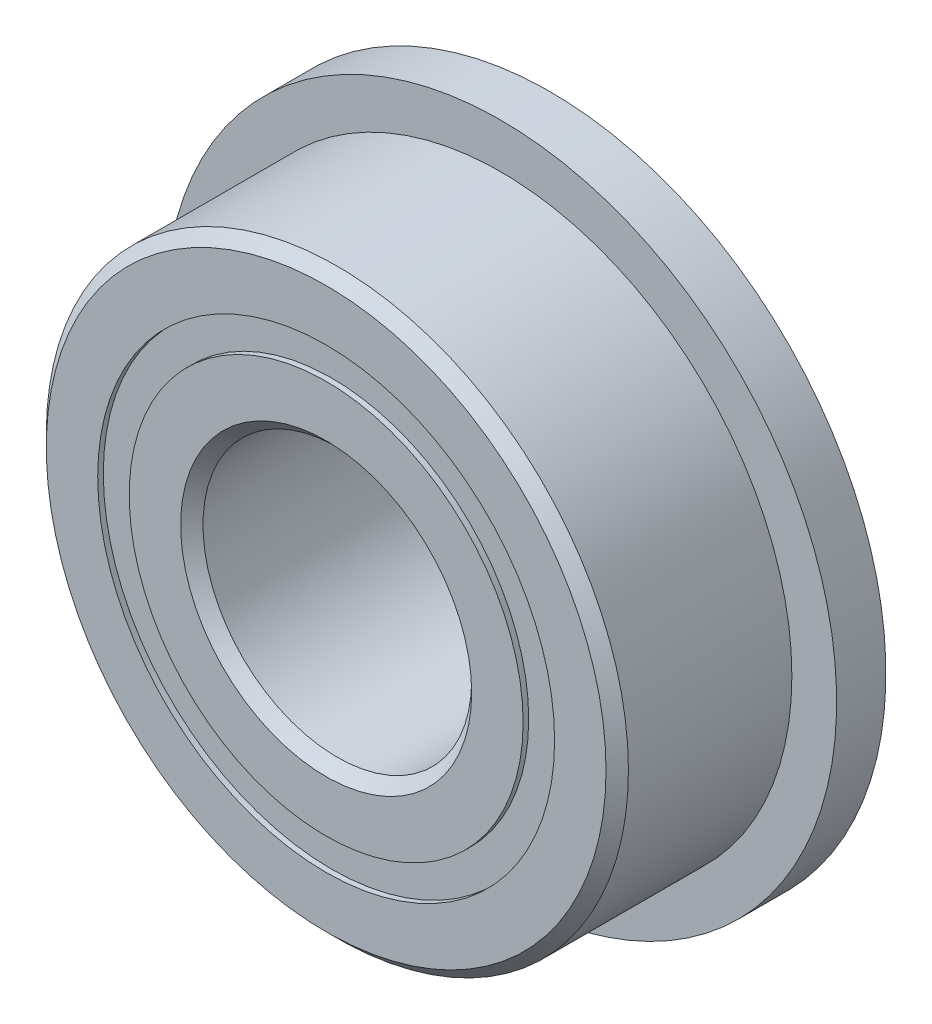
ISO-10303-21;
HEADER;
FILE_DESCRIPTION(('STEP AP214'),'2;1');
FILE_NAME('part.step','',(''),(''),'','','');
FILE_SCHEMA(('AUTOMOTIVE_DESIGN { 1 0 10303 214 1 1 1 1 }'));
ENDSEC;
DATA;
#1=APPLICATION_CONTEXT('core data for automotive mechanical design processes');
#2=APPLICATION_PROTOCOL_DEFINITION('international standard','automotive_design',2000,#1);
#3=PRODUCT_CONTEXT('',#1,'mechanical');
#4=PRODUCT('Part','Part','',(#3));
#5=PRODUCT_RELATED_PRODUCT_CATEGORY('part','',(#4));
#6=PRODUCT_DEFINITION_FORMATION('','',#4);
#7=PRODUCT_DEFINITION_CONTEXT('part definition',#1,'design');
#8=PRODUCT_DEFINITION('design','',#6,#7);
#9=PRODUCT_DEFINITION_SHAPE('','',#8);
#10=(LENGTH_UNIT() NAMED_UNIT(*) SI_UNIT(.MILLI.,.METRE.));
#11=(NAMED_UNIT(*) PLANE_ANGLE_UNIT() SI_UNIT($,.RADIAN.));
#12=(NAMED_UNIT(*) SI_UNIT($,.STERADIAN.) SOLID_ANGLE_UNIT());
#13=UNCERTAINTY_MEASURE_WITH_UNIT(LENGTH_MEASURE(1.E-05),#10,'distance_accuracy_value','');
#14=(GEOMETRIC_REPRESENTATION_CONTEXT(3) GLOBAL_UNCERTAINTY_ASSIGNED_CONTEXT((#13)) GLOBAL_UNIT_ASSIGNED_CONTEXT((#10,
#11,#12)) REPRESENTATION_CONTEXT('',''));
#15=CARTESIAN_POINT('',(0.,0.,0.));
#16=DIRECTION('',(0.,0.,1.));
#17=DIRECTION('',(1.,0.,0.));
#18=AXIS2_PLACEMENT_3D('',#15,#16,#17);
#19=CARTESIAN_POINT('',(0.,5.10164835164835,-2.375));
#20=DIRECTION('',(0.,0.,1.));
#21=DIRECTION('',(1.,0.,0.));
#22=AXIS2_PLACEMENT_3D('',#19,#20,#21);
#23=PLANE('',#22);
#24=CARTESIAN_POINT('',(0.,0.,-2.375));
#25=DIRECTION('',(0.,0.,1.));
#26=DIRECTION('',(1.,0.,0.));
#27=AXIS2_PLACEMENT_3D('',#24,#25,#26);
#28=CIRCLE('',#27,5.10164835164835);
#29=CARTESIAN_POINT('',(5.10164835164835,0.,-2.375));
#30=VERTEX_POINT('',#29);
#31=EDGE_CURVE('E65',#30,#30,#28,.T.);
#32=ORIENTED_EDGE('',*,*,#31,.F.);
#33=EDGE_LOOP('',(#32));
#34=FACE_BOUND('',#33,.T.);
#35=CARTESIAN_POINT('',(0.,0.,-2.375));
#36=DIRECTION('',(0.,0.,1.));
#37=DIRECTION('',(1.,0.,0.));
#38=AXIS2_PLACEMENT_3D('',#35,#36,#37);
#39=CIRCLE('',#38,4.39835164835165);
#40=CARTESIAN_POINT('',(4.39835164835165,0.,-2.375));
#41=VERTEX_POINT('',#40);
#42=EDGE_CURVE('E13',#41,#41,#39,.T.);
#43=ORIENTED_EDGE('',*,*,#42,.T.);
#44=EDGE_LOOP('',(#43));
#45=FACE_BOUND('',#44,.T.);
#46=ADVANCED_FACE('F51',(#34,#45),#23,.F.);
#47=CARTESIAN_POINT('',(0.,0.,2.5));
#48=DIRECTION('',(0.,0.,1.));
#49=DIRECTION('',(1.,0.,0.));
#50=AXIS2_PLACEMENT_3D('',#47,#48,#49);
#51=CYLINDRICAL_SURFACE('',#50,4.39835164835165);
#52=ORIENTED_EDGE('',*,*,#42,.F.);
#53=EDGE_LOOP('',(#52));
#54=FACE_BOUND('',#53,.T.);
#55=CARTESIAN_POINT('',(0.,0.,-1.16542887575844));
#56=DIRECTION('',(0.,0.,1.));
#57=DIRECTION('',(1.,0.,0.));
#58=AXIS2_PLACEMENT_3D('',#55,#56,#57);
#59=CIRCLE('',#58,4.39835164835165);
#60=CARTESIAN_POINT('',(4.39835164835165,0.,-1.16542887575844));
#61=VERTEX_POINT('',#60);
#62=EDGE_CURVE('E57',#61,#61,#59,.T.);
#63=ORIENTED_EDGE('',*,*,#62,.T.);
#64=EDGE_LOOP('',(#63));
#65=FACE_BOUND('',#64,.T.);
#66=ADVANCED_FACE('F74',(#54,#65),#51,.F.);
#67=CARTESIAN_POINT('',(0.,5.10164835164835,-1.16542887575844));
#68=DIRECTION('',(0.,0.,-1.));
#69=DIRECTION('',(-1.,0.,0.));
#70=AXIS2_PLACEMENT_3D('',#67,#68,#69);
#71=PLANE('',#70);
#72=ORIENTED_EDGE('',*,*,#62,.F.);
#73=EDGE_LOOP('',(#72));
#74=FACE_BOUND('',#73,.T.);
#75=CARTESIAN_POINT('',(0.,0.,-1.16542887575844));
#76=DIRECTION('',(0.,0.,1.));
#77=DIRECTION('',(1.,0.,0.));
#78=AXIS2_PLACEMENT_3D('',#75,#76,#77);
#79=CIRCLE('',#78,5.10164835164835);
#80=CARTESIAN_POINT('',(5.10164835164835,0.,-1.16542887575844));
#81=VERTEX_POINT('',#80);
#82=EDGE_CURVE('E61',#81,#81,#79,.T.);
#83=ORIENTED_EDGE('',*,*,#82,.T.);
#84=EDGE_LOOP('',(#83));
#85=FACE_BOUND('',#84,.T.);
#86=ADVANCED_FACE('F78',(#74,#85),#71,.F.);
#87=CARTESIAN_POINT('',(0.,0.,2.5));
#88=DIRECTION('',(0.,0.,1.));
#89=DIRECTION('',(1.,0.,0.));
#90=AXIS2_PLACEMENT_3D('',#87,#88,#89);
#91=CYLINDRICAL_SURFACE('',#90,5.10164835164835);
#92=ORIENTED_EDGE('',*,*,#82,.F.);
#93=EDGE_LOOP('',(#92));
#94=FACE_BOUND('',#93,.T.);
#95=ORIENTED_EDGE('',*,*,#31,.T.);
#96=EDGE_LOOP('',(#95));
#97=FACE_BOUND('',#96,.T.);
#98=ADVANCED_FACE('F71',(#94,#97),#91,.T.);
#99=CLOSED_SHELL('',(#46,#66,#86,#98));
#100=MANIFOLD_SOLID_BREP('B2',#99);
#101=CARTESIAN_POINT('',(0.,5.10164835164835,2.375));
#102=DIRECTION('',(0.,0.,-1.));
#103=DIRECTION('',(-1.,0.,0.));
#104=AXIS2_PLACEMENT_3D('',#101,#102,#103);
#105=PLANE('',#104);
#106=CARTESIAN_POINT('',(0.,0.,2.375));
#107=DIRECTION('',(0.,0.,1.));
#108=DIRECTION('',(1.,0.,0.));
#109=AXIS2_PLACEMENT_3D('',#106,#107,#108);
#110=CIRCLE('',#109,4.39835164835165);
#111=CARTESIAN_POINT('',(4.39835164835165,0.,2.375));
#112=VERTEX_POINT('',#111);
#113=EDGE_CURVE('E50',#112,#112,#110,.T.);
#114=ORIENTED_EDGE('',*,*,#113,.F.);
#115=EDGE_LOOP('',(#114));
#116=FACE_BOUND('',#115,.T.);
#117=CARTESIAN_POINT('',(0.,0.,2.375));
#118=DIRECTION('',(0.,0.,1.));
#119=DIRECTION('',(1.,0.,0.));
#120=AXIS2_PLACEMENT_3D('',#117,#118,#119);
#121=CIRCLE('',#120,5.10164835164835);
#122=CARTESIAN_POINT('',(5.10164835164835,0.,2.375));
#123=VERTEX_POINT('',#122);
#124=EDGE_CURVE('E138',#123,#123,#121,.T.);
#125=ORIENTED_EDGE('',*,*,#124,.T.);
#126=EDGE_LOOP('',(#125));
#127=FACE_BOUND('',#126,.T.);
#128=ADVANCED_FACE('F124',(#116,#127),#105,.F.);
#129=CARTESIAN_POINT('',(0.,0.,2.5));
#130=DIRECTION('',(0.,0.,1.));
#131=DIRECTION('',(1.,0.,0.));
#132=AXIS2_PLACEMENT_3D('',#129,#130,#131);
#133=CYLINDRICAL_SURFACE('',#132,4.39835164835165);
#134=CARTESIAN_POINT('',(0.,0.,1.16542887575843));
#135=DIRECTION('',(0.,0.,1.));
#136=DIRECTION('',(1.,0.,0.));
#137=AXIS2_PLACEMENT_3D('',#134,#135,#136);
#138=CIRCLE('',#137,4.39835164835165);
#139=CARTESIAN_POINT('',(4.39835164835165,0.,1.16542887575843));
#140=VERTEX_POINT('',#139);
#141=EDGE_CURVE('E130',#140,#140,#138,.T.);
#142=ORIENTED_EDGE('',*,*,#141,.F.);
#143=EDGE_LOOP('',(#142));
#144=FACE_BOUND('',#143,.T.);
#145=ORIENTED_EDGE('',*,*,#113,.T.);
#146=EDGE_LOOP('',(#145));
#147=FACE_BOUND('',#146,.T.);
#148=ADVANCED_FACE('F153',(#144,#147),#133,.F.);
#149=CARTESIAN_POINT('',(0.,5.10164835164835,1.16542887575843));
#150=DIRECTION('',(0.,0.,1.));
#151=DIRECTION('',(1.,0.,0.));
#152=AXIS2_PLACEMENT_3D('',#149,#150,#151);
#153=PLANE('',#152);
#154=CARTESIAN_POINT('',(0.,0.,1.16542887575843));
#155=DIRECTION('',(0.,0.,1.));
#156=DIRECTION('',(1.,0.,0.));
#157=AXIS2_PLACEMENT_3D('',#154,#155,#156);
#158=CIRCLE('',#157,5.10164835164835);
#159=CARTESIAN_POINT('',(5.10164835164835,0.,1.16542887575843));
#160=VERTEX_POINT('',#159);
#161=EDGE_CURVE('E134',#160,#160,#158,.T.);
#162=ORIENTED_EDGE('',*,*,#161,.F.);
#163=EDGE_LOOP('',(#162));
#164=FACE_BOUND('',#163,.T.);
#165=ORIENTED_EDGE('',*,*,#141,.T.);
#166=EDGE_LOOP('',(#165));
#167=FACE_BOUND('',#166,.T.);
#168=ADVANCED_FACE('F148',(#164,#167),#153,.F.);
#169=CARTESIAN_POINT('',(0.,0.,2.5));
#170=DIRECTION('',(0.,0.,1.));
#171=DIRECTION('',(1.,0.,0.));
#172=AXIS2_PLACEMENT_3D('',#169,#170,#171);
#173=CYLINDRICAL_SURFACE('',#172,5.10164835164835);
#174=ORIENTED_EDGE('',*,*,#124,.F.);
#175=EDGE_LOOP('',(#174));
#176=FACE_BOUND('',#175,.T.);
#177=ORIENTED_EDGE('',*,*,#161,.T.);
#178=EDGE_LOOP('',(#177));
#179=FACE_BOUND('',#178,.T.);
#180=ADVANCED_FACE('F145',(#176,#179),#173,.T.);
#181=CLOSED_SHELL('',(#128,#148,#168,#180));
#182=MANIFOLD_SOLID_BREP('B8',#181);
#183=CARTESIAN_POINT('',(-2.37499999999995,4.11362066797611,0.));
#184=DIRECTION('',(0.,0.,1.));
#185=DIRECTION('',(0.499999999999989,-0.866025403784445,0.));
#186=AXIS2_PLACEMENT_3D('',#183,#184,#185);
#187=SPHERICAL_SURFACE('',#186,1.16542887575844);
#188=CARTESIAN_POINT('',(-2.37499999999995,4.11362066797611,1.16542887575843));
#189=VERTEX_POINT('',#188);
#190=VERTEX_LOOP('',#189);
#191=FACE_BOUND('',#190,.T.);
#192=ADVANCED_FACE('F192',(#191),#187,.T.);
#193=CLOSED_SHELL('',(#192));
#194=MANIFOLD_SOLID_BREP('B45',#193);
#195=CARTESIAN_POINT('',(-4.11362066797606,2.37500000000005,0.));
#196=DIRECTION('',(0.,0.,1.));
#197=DIRECTION('',(0.866025403784433,-0.50000000000001,0.));
#198=AXIS2_PLACEMENT_3D('',#195,#196,#197);
#199=SPHERICAL_SURFACE('',#198,1.16542887575844);
#200=CARTESIAN_POINT('',(-4.11362066797606,2.37500000000005,1.16542887575843));
#201=VERTEX_POINT('',#200);
#202=VERTEX_LOOP('',#201);
#203=FACE_BOUND('',#202,.T.);
#204=ADVANCED_FACE('F215',(#203),#199,.T.);
#205=CLOSED_SHELL('',(#204));
#206=MANIFOLD_SOLID_BREP('B120',#205);
#207=CARTESIAN_POINT('',(-4.75,0.,0.));
#208=DIRECTION('',(0.,0.,1.));
#209=DIRECTION('',(1.,0.,0.));
#210=AXIS2_PLACEMENT_3D('',#207,#208,#209);
#211=SPHERICAL_SURFACE('',#210,1.16542887575844);
#212=CARTESIAN_POINT('',(-4.75,0.,1.16542887575843));
#213=VERTEX_POINT('',#212);
#214=VERTEX_LOOP('',#213);
#215=FACE_BOUND('',#214,.T.);
#216=ADVANCED_FACE('F238',(#215),#211,.T.);
#217=CLOSED_SHELL('',(#216));
#218=MANIFOLD_SOLID_BREP('B188',#217);
#219=CARTESIAN_POINT('',(-4.1136206679761,-2.37499999999996,0.));
#220=DIRECTION('',(0.,0.,1.));
#221=DIRECTION('',(0.866025403784443,0.499999999999992,0.));
#222=AXIS2_PLACEMENT_3D('',#219,#220,#221);
#223=SPHERICAL_SURFACE('',#222,1.16542887575844);
#224=CARTESIAN_POINT('',(-4.1136206679761,-2.37499999999996,1.16542887575843));
#225=VERTEX_POINT('',#224);
#226=VERTEX_LOOP('',#225);
#227=FACE_BOUND('',#226,.T.);
#228=ADVANCED_FACE('F261',(#227),#223,.T.);
#229=CLOSED_SHELL('',(#228));
#230=MANIFOLD_SOLID_BREP('B211',#229);
#231=CARTESIAN_POINT('',(-2.37500000000003,-4.11362066797606,0.));
#232=DIRECTION('',(0.,0.,1.));
#233=DIRECTION('',(0.500000000000007,0.866025403784435,0.));
#234=AXIS2_PLACEMENT_3D('',#231,#232,#233);
#235=SPHERICAL_SURFACE('',#234,1.16542887575844);
#236=CARTESIAN_POINT('',(-2.37500000000003,-4.11362066797606,1.16542887575843));
#237=VERTEX_POINT('',#236);
#238=VERTEX_LOOP('',#237);
#239=FACE_BOUND('',#238,.T.);
#240=ADVANCED_FACE('F283',(#239),#235,.T.);
#241=CLOSED_SHELL('',(#240));
#242=MANIFOLD_SOLID_BREP('B234',#241);
#243=CARTESIAN_POINT('',(0.,-4.75,0.));
#244=DIRECTION('',(0.,0.,1.));
#245=DIRECTION('',(0.,1.,0.));
#246=AXIS2_PLACEMENT_3D('',#243,#244,#245);
#247=SPHERICAL_SURFACE('',#246,1.16542887575844);
#248=CARTESIAN_POINT('',(0.,-4.75,1.16542887575843));
#249=VERTEX_POINT('',#248);
#250=VERTEX_LOOP('',#249);
#251=FACE_BOUND('',#250,.T.);
#252=ADVANCED_FACE('F305',(#251),#247,.T.);
#253=CLOSED_SHELL('',(#252));
#254=MANIFOLD_SOLID_BREP('B257',#253);
#255=CARTESIAN_POINT('',(2.37499999999998,-4.1136206679761,0.));
#256=DIRECTION('',(0.,0.,1.));
#257=DIRECTION('',(-0.499999999999995,0.866025403784442,0.));
#258=AXIS2_PLACEMENT_3D('',#255,#256,#257);
#259=SPHERICAL_SURFACE('',#258,1.16542887575844);
#260=CARTESIAN_POINT('',(2.37499999999998,-4.1136206679761,1.16542887575843));
#261=VERTEX_POINT('',#260);
#262=VERTEX_LOOP('',#261);
#263=FACE_BOUND('',#262,.T.);
#264=ADVANCED_FACE('F327',(#263),#259,.T.);
#265=CLOSED_SHELL('',(#264));
#266=MANIFOLD_SOLID_BREP('B279',#265);
#267=CARTESIAN_POINT('',(4.11362066797607,-2.37500000000002,0.));
#268=DIRECTION('',(0.,0.,1.));
#269=DIRECTION('',(-0.866025403784436,0.500000000000004,0.));
#270=AXIS2_PLACEMENT_3D('',#267,#268,#269);
#271=SPHERICAL_SURFACE('',#270,1.16542887575844);
#272=CARTESIAN_POINT('',(4.11362066797607,-2.37500000000002,1.16542887575843));
#273=VERTEX_POINT('',#272);
#274=VERTEX_LOOP('',#273);
#275=FACE_BOUND('',#274,.T.);
#276=ADVANCED_FACE('F350',(#275),#271,.T.);
#277=CLOSED_SHELL('',(#276));
#278=MANIFOLD_SOLID_BREP('B301',#277);
#279=CARTESIAN_POINT('',(4.75,0.,0.));
#280=DIRECTION('',(0.,0.,1.));
#281=DIRECTION('',(-1.,0.,0.));
#282=AXIS2_PLACEMENT_3D('',#279,#280,#281);
#283=SPHERICAL_SURFACE('',#282,1.16542887575844);
#284=CARTESIAN_POINT('',(4.75,0.,1.16542887575843));
#285=VERTEX_POINT('',#284);
#286=VERTEX_LOOP('',#285);
#287=FACE_BOUND('',#286,.T.);
#288=ADVANCED_FACE('F373',(#287),#283,.T.);
#289=CLOSED_SHELL('',(#288));
#290=MANIFOLD_SOLID_BREP('B323',#289);
#291=CARTESIAN_POINT('',(4.11362066797609,2.37499999999999,0.));
#292=DIRECTION('',(0.,0.,1.));
#293=DIRECTION('',(-0.86602540378444,-0.499999999999998,0.));
#294=AXIS2_PLACEMENT_3D('',#291,#292,#293);
#295=SPHERICAL_SURFACE('',#294,1.16542887575844);
#296=CARTESIAN_POINT('',(4.11362066797609,2.37499999999999,1.16542887575843));
#297=VERTEX_POINT('',#296);
#298=VERTEX_LOOP('',#297);
#299=FACE_BOUND('',#298,.T.);
#300=ADVANCED_FACE('F395',(#299),#295,.T.);
#301=CLOSED_SHELL('',(#300));
#302=MANIFOLD_SOLID_BREP('B346',#301);
#303=CARTESIAN_POINT('',(2.375,4.11362066797608,0.));
#304=DIRECTION('',(0.,0.,1.));
#305=DIRECTION('',(-0.500000000000001,-0.866025403784438,0.));
#306=AXIS2_PLACEMENT_3D('',#303,#304,#305);
#307=SPHERICAL_SURFACE('',#306,1.16542887575844);
#308=CARTESIAN_POINT('',(2.375,4.11362066797608,1.16542887575843));
#309=VERTEX_POINT('',#308);
#310=VERTEX_LOOP('',#309);
#311=FACE_BOUND('',#310,.T.);
#312=ADVANCED_FACE('F416',(#311),#307,.T.);
#313=CLOSED_SHELL('',(#312));
#314=MANIFOLD_SOLID_BREP('B369',#313);
#315=CARTESIAN_POINT('',(0.,4.75,0.));
#316=DIRECTION('',(0.,0.,1.));
#317=DIRECTION('',(0.,-1.,0.));
#318=AXIS2_PLACEMENT_3D('',#315,#316,#317);
#319=SPHERICAL_SURFACE('',#318,1.16542887575844);
#320=CARTESIAN_POINT('',(0.,4.75,1.16542887575843));
#321=VERTEX_POINT('',#320);
#322=VERTEX_LOOP('',#321);
#323=FACE_BOUND('',#322,.T.);
#324=ADVANCED_FACE('F438',(#323),#319,.T.);
#325=CLOSED_SHELL('',(#324));
#326=MANIFOLD_SOLID_BREP('B391',#325);
#327=CARTESIAN_POINT('',(0.,4.39835164835165,2.5));
#328=DIRECTION('',(0.,0.,-1.));
#329=DIRECTION('',(-1.,0.,0.));
#330=AXIS2_PLACEMENT_3D('',#327,#328,#329);
#331=PLANE('',#330);
#332=CARTESIAN_POINT('',(0.,0.,2.5));
#333=DIRECTION('',(0.,0.,1.));
#334=DIRECTION('',(1.,0.,0.));
#335=AXIS2_PLACEMENT_3D('',#332,#333,#334);
#336=CIRCLE('',#335,3.25);
#337=CARTESIAN_POINT('',(3.25,0.,2.5));
#338=VERTEX_POINT('',#337);
#339=EDGE_CURVE('E493',#338,#338,#336,.T.);
#340=ORIENTED_EDGE('',*,*,#339,.F.);
#341=EDGE_LOOP('',(#340));
#342=FACE_BOUND('',#341,.T.);
#343=CARTESIAN_POINT('',(0.,0.,2.5));
#344=DIRECTION('',(0.,0.,1.));
#345=DIRECTION('',(1.,0.,0.));
#346=AXIS2_PLACEMENT_3D('',#343,#344,#345);
#347=CIRCLE('',#346,4.39835164835165);
#348=CARTESIAN_POINT('',(4.39835164835165,0.,2.5));
#349=VERTEX_POINT('',#348);
#350=EDGE_CURVE('E437',#349,#349,#347,.T.);
#351=ORIENTED_EDGE('',*,*,#350,.T.);
#352=EDGE_LOOP('',(#351));
#353=FACE_BOUND('',#352,.T.);
#354=ADVANCED_FACE('F465',(#342,#353),#331,.F.);
#355=CARTESIAN_POINT('',(0.,0.,2.5));
#356=DIRECTION('',(0.,0.,1.));
#357=DIRECTION('',(1.,0.,0.));
#358=AXIS2_PLACEMENT_3D('',#355,#356,#357);
#359=CYLINDRICAL_SURFACE('',#358,4.39835164835165);
#360=ORIENTED_EDGE('',*,*,#350,.F.);
#361=EDGE_LOOP('',(#360));
#362=FACE_BOUND('',#361,.T.);
#363=CARTESIAN_POINT('',(0.,0.,1.11111111111111));
#364=DIRECTION('',(0.,0.,1.));
#365=DIRECTION('',(1.,0.,0.));
#366=AXIS2_PLACEMENT_3D('',#363,#364,#365);
#367=CIRCLE('',#366,4.39835164835165);
#368=CARTESIAN_POINT('',(4.39835164835165,0.,1.11111111111111));
#369=VERTEX_POINT('',#368);
#370=EDGE_CURVE('E471',#369,#369,#367,.T.);
#371=ORIENTED_EDGE('',*,*,#370,.T.);
#372=EDGE_LOOP('',(#371));
#373=FACE_BOUND('',#372,.T.);
#374=ADVANCED_FACE('F500',(#362,#373),#359,.T.);
#375=CARTESIAN_POINT('',(0.,0.,0.));
#376=DIRECTION('',(0.,0.,1.));
#377=DIRECTION('',(1.,0.,0.));
#378=AXIS2_PLACEMENT_3D('',#375,#376,#377);
#379=TOROIDAL_SURFACE('',#378,4.75,1.16542887575843);
#380=ORIENTED_EDGE('',*,*,#370,.F.);
#381=EDGE_LOOP('',(#380));
#382=FACE_BOUND('',#381,.T.);
#383=CARTESIAN_POINT('',(0.,0.,-1.11111111111111));
#384=DIRECTION('',(0.,0.,1.));
#385=DIRECTION('',(1.,0.,0.));
#386=AXIS2_PLACEMENT_3D('',#383,#384,#385);
#387=CIRCLE('',#386,4.39835164835165);
#388=CARTESIAN_POINT('',(4.39835164835165,0.,-1.11111111111111));
#389=VERTEX_POINT('',#388);
#390=EDGE_CURVE('E475',#389,#389,#387,.T.);
#391=ORIENTED_EDGE('',*,*,#390,.T.);
#392=EDGE_LOOP('',(#391));
#393=FACE_BOUND('',#392,.T.);
#394=ADVANCED_FACE('F504',(#382,#393),#379,.F.);
#395=CARTESIAN_POINT('',(0.,0.,2.5));
#396=DIRECTION('',(0.,0.,1.));
#397=DIRECTION('',(1.,0.,0.));
#398=AXIS2_PLACEMENT_3D('',#395,#396,#397);
#399=CYLINDRICAL_SURFACE('',#398,4.39835164835165);
#400=ORIENTED_EDGE('',*,*,#390,.F.);
#401=EDGE_LOOP('',(#400));
#402=FACE_BOUND('',#401,.T.);
#403=CARTESIAN_POINT('',(0.,0.,-2.5));
#404=DIRECTION('',(0.,0.,1.));
#405=DIRECTION('',(1.,0.,0.));
#406=AXIS2_PLACEMENT_3D('',#403,#404,#405);
#407=CIRCLE('',#406,4.39835164835165);
#408=CARTESIAN_POINT('',(4.39835164835165,0.,-2.5));
#409=VERTEX_POINT('',#408);
#410=EDGE_CURVE('E479',#409,#409,#407,.T.);
#411=ORIENTED_EDGE('',*,*,#410,.T.);
#412=EDGE_LOOP('',(#411));
#413=FACE_BOUND('',#412,.T.);
#414=ADVANCED_FACE('F509',(#402,#413),#399,.T.);
#415=CARTESIAN_POINT('',(0.,3.25,-2.5));
#416=DIRECTION('',(0.,0.,1.));
#417=DIRECTION('',(1.,0.,0.));
#418=AXIS2_PLACEMENT_3D('',#415,#416,#417);
#419=PLANE('',#418);
#420=ORIENTED_EDGE('',*,*,#410,.F.);
#421=EDGE_LOOP('',(#420));
#422=FACE_BOUND('',#421,.T.);
#423=CARTESIAN_POINT('',(0.,0.,-2.5));
#424=DIRECTION('',(0.,0.,1.));
#425=DIRECTION('',(1.,0.,0.));
#426=AXIS2_PLACEMENT_3D('',#423,#424,#425);
#427=CIRCLE('',#426,3.25);
#428=CARTESIAN_POINT('',(3.25,0.,-2.5));
#429=VERTEX_POINT('',#428);
#430=EDGE_CURVE('E484',#429,#429,#427,.T.);
#431=ORIENTED_EDGE('',*,*,#430,.T.);
#432=EDGE_LOOP('',(#431));
#433=FACE_BOUND('',#432,.T.);
#434=ADVANCED_FACE('F515',(#422,#433),#419,.F.);
#435=CARTESIAN_POINT('',(0.,0.,-2.25));
#436=DIRECTION('',(0.,0.,-1.));
#437=DIRECTION('',(-1.,0.,0.));
#438=AXIS2_PLACEMENT_3D('',#435,#436,#437);
#439=CONICAL_SURFACE('',#438,3.,0.785398163397448);
#440=ORIENTED_EDGE('',*,*,#430,.F.);
#441=EDGE_LOOP('',(#440));
#442=FACE_BOUND('',#441,.T.);
#443=CARTESIAN_POINT('',(0.,0.,-2.25));
#444=DIRECTION('',(0.,0.,1.));
#445=DIRECTION('',(1.,0.,0.));
#446=AXIS2_PLACEMENT_3D('',#443,#444,#445);
#447=CIRCLE('',#446,3.);
#448=CARTESIAN_POINT('',(3.,0.,-2.25));
#449=VERTEX_POINT('',#448);
#450=EDGE_CURVE('E487',#449,#449,#447,.T.);
#451=ORIENTED_EDGE('',*,*,#450,.T.);
#452=EDGE_LOOP('',(#451));
#453=FACE_BOUND('',#452,.T.);
#454=ADVANCED_FACE('F519',(#442,#453),#439,.F.);
#455=CARTESIAN_POINT('',(0.,0.,2.5));
#456=DIRECTION('',(0.,0.,1.));
#457=DIRECTION('',(1.,0.,0.));
#458=AXIS2_PLACEMENT_3D('',#455,#456,#457);
#459=CYLINDRICAL_SURFACE('',#458,3.);
#460=ORIENTED_EDGE('',*,*,#450,.F.);
#461=EDGE_LOOP('',(#460));
#462=FACE_BOUND('',#461,.T.);
#463=CARTESIAN_POINT('',(0.,0.,2.25));
#464=DIRECTION('',(0.,0.,1.));
#465=DIRECTION('',(1.,0.,0.));
#466=AXIS2_PLACEMENT_3D('',#463,#464,#465);
#467=CIRCLE('',#466,3.);
#468=CARTESIAN_POINT('',(3.,0.,2.25));
#469=VERTEX_POINT('',#468);
#470=EDGE_CURVE('E490',#469,#469,#467,.T.);
#471=ORIENTED_EDGE('',*,*,#470,.T.);
#472=EDGE_LOOP('',(#471));
#473=FACE_BOUND('',#472,.T.);
#474=ADVANCED_FACE('F523',(#462,#473),#459,.F.);
#475=CARTESIAN_POINT('',(0.,0.,2.5));
#476=DIRECTION('',(0.,0.,1.));
#477=DIRECTION('',(1.,0.,0.));
#478=AXIS2_PLACEMENT_3D('',#475,#476,#477);
#479=CONICAL_SURFACE('',#478,3.25,0.785398163397449);
#480=ORIENTED_EDGE('',*,*,#470,.F.);
#481=EDGE_LOOP('',(#480));
#482=FACE_BOUND('',#481,.T.);
#483=ORIENTED_EDGE('',*,*,#339,.T.);
#484=EDGE_LOOP('',(#483));
#485=FACE_BOUND('',#484,.T.);
#486=ADVANCED_FACE('F497',(#482,#485),#479,.F.);
#487=CLOSED_SHELL('',(#354,#374,#394,#414,#434,#454,#474,#486));
#488=MANIFOLD_SOLID_BREP('B412',#487);
#489=CARTESIAN_POINT('',(0.,0.,2.25));
#490=DIRECTION('',(0.,0.,-1.));
#491=DIRECTION('',(-1.,0.,0.));
#492=AXIS2_PLACEMENT_3D('',#489,#490,#491);
#493=CONICAL_SURFACE('',#492,6.5,0.785398163397449);
#494=CARTESIAN_POINT('',(0.,0.,2.5));
#495=DIRECTION('',(0.,0.,1.));
#496=DIRECTION('',(1.,0.,0.));
#497=AXIS2_PLACEMENT_3D('',#494,#495,#496);
#498=CIRCLE('',#497,6.25);
#499=CARTESIAN_POINT('',(6.25,0.,2.5));
#500=VERTEX_POINT('',#499);
#501=EDGE_CURVE('E614',#500,#500,#498,.T.);
#502=ORIENTED_EDGE('',*,*,#501,.F.);
#503=EDGE_LOOP('',(#502));
#504=FACE_BOUND('',#503,.T.);
#505=CARTESIAN_POINT('',(0.,0.,2.25));
#506=DIRECTION('',(0.,0.,1.));
#507=DIRECTION('',(1.,0.,0.));
#508=AXIS2_PLACEMENT_3D('',#505,#506,#507);
#509=CIRCLE('',#508,6.5);
#510=CARTESIAN_POINT('',(6.5,0.,2.25));
#511=VERTEX_POINT('',#510);
#512=EDGE_CURVE('E464',#511,#511,#509,.T.);
#513=ORIENTED_EDGE('',*,*,#512,.T.);
#514=EDGE_LOOP('',(#513));
#515=FACE_BOUND('',#514,.T.);
#516=ADVANCED_FACE('F592',(#504,#515),#493,.T.);
#517=CARTESIAN_POINT('',(0.,0.,2.5));
#518=DIRECTION('',(0.,0.,1.));
#519=DIRECTION('',(1.,0.,0.));
#520=AXIS2_PLACEMENT_3D('',#517,#518,#519);
#521=CYLINDRICAL_SURFACE('',#520,6.5);
#522=CARTESIAN_POINT('',(0.,0.,-1.4));
#523=DIRECTION('',(0.,0.,1.));
#524=DIRECTION('',(1.,0.,0.));
#525=AXIS2_PLACEMENT_3D('',#522,#523,#524);
#526=CIRCLE('',#525,6.5);
#527=CARTESIAN_POINT('',(6.5,0.,-1.4));
#528=VERTEX_POINT('',#527);
#529=EDGE_CURVE('E617',#528,#528,#526,.T.);
#530=ORIENTED_EDGE('',*,*,#529,.T.);
#531=EDGE_LOOP('',(#530));
#532=FACE_BOUND('',#531,.T.);
#533=ORIENTED_EDGE('',*,*,#512,.F.);
#534=EDGE_LOOP('',(#533));
#535=FACE_BOUND('',#534,.T.);
#536=ADVANCED_FACE('F637',(#532,#535),#521,.T.);
#537=CARTESIAN_POINT('',(0.,6.25,-2.5));
#538=DIRECTION('',(0.,0.,1.));
#539=DIRECTION('',(1.,0.,0.));
#540=AXIS2_PLACEMENT_3D('',#537,#538,#539);
#541=PLANE('',#540);
#542=CARTESIAN_POINT('',(0.,0.,-2.5));
#543=DIRECTION('',(0.,0.,1.));
#544=DIRECTION('',(1.,0.,0.));
#545=AXIS2_PLACEMENT_3D('',#542,#543,#544);
#546=CIRCLE('',#545,5.10164835164835);
#547=CARTESIAN_POINT('',(5.10164835164835,0.,-2.5));
#548=VERTEX_POINT('',#547);
#549=EDGE_CURVE('E598',#548,#548,#546,.T.);
#550=ORIENTED_EDGE('',*,*,#549,.T.);
#551=EDGE_LOOP('',(#550));
#552=FACE_BOUND('',#551,.T.);
#553=CARTESIAN_POINT('',(0.,0.,-2.5));
#554=DIRECTION('',(0.,0.,-1.));
#555=DIRECTION('',(-1.,0.,0.));
#556=AXIS2_PLACEMENT_3D('',#553,#554,#555);
#557=CIRCLE('',#556,7.5);
#558=CARTESIAN_POINT('',(-7.5,0.,-2.5));
#559=VERTEX_POINT('',#558);
#560=EDGE_CURVE('E620',#559,#559,#557,.T.);
#561=ORIENTED_EDGE('',*,*,#560,.T.);
#562=EDGE_LOOP('',(#561));
#563=FACE_BOUND('',#562,.T.);
#564=ADVANCED_FACE('F640',(#552,#563),#541,.F.);
#565=CARTESIAN_POINT('',(0.,0.,2.5));
#566=DIRECTION('',(0.,0.,1.));
#567=DIRECTION('',(1.,0.,0.));
#568=AXIS2_PLACEMENT_3D('',#565,#566,#567);
#569=CYLINDRICAL_SURFACE('',#568,5.10164835164835);
#570=CARTESIAN_POINT('',(0.,0.,-1.11111111111111));
#571=DIRECTION('',(0.,0.,1.));
#572=DIRECTION('',(1.,0.,0.));
#573=AXIS2_PLACEMENT_3D('',#570,#571,#572);
#574=CIRCLE('',#573,5.10164835164835);
#575=CARTESIAN_POINT('',(5.10164835164835,0.,-1.11111111111111));
#576=VERTEX_POINT('',#575);
#577=EDGE_CURVE('E602',#576,#576,#574,.T.);
#578=ORIENTED_EDGE('',*,*,#577,.T.);
#579=EDGE_LOOP('',(#578));
#580=FACE_BOUND('',#579,.T.);
#581=ORIENTED_EDGE('',*,*,#549,.F.);
#582=EDGE_LOOP('',(#581));
#583=FACE_BOUND('',#582,.T.);
#584=ADVANCED_FACE('F645',(#580,#583),#569,.F.);
#585=CARTESIAN_POINT('',(0.,0.,0.));
#586=DIRECTION('',(0.,0.,1.));
#587=DIRECTION('',(1.,0.,0.));
#588=AXIS2_PLACEMENT_3D('',#585,#586,#587);
#589=TOROIDAL_SURFACE('',#588,4.75,1.16542887575844);
#590=ORIENTED_EDGE('',*,*,#577,.F.);
#591=EDGE_LOOP('',(#590));
#592=FACE_BOUND('',#591,.T.);
#593=CARTESIAN_POINT('',(0.,0.,1.11111111111111));
#594=DIRECTION('',(0.,0.,1.));
#595=DIRECTION('',(1.,0.,0.));
#596=AXIS2_PLACEMENT_3D('',#593,#594,#595);
#597=CIRCLE('',#596,5.10164835164835);
#598=CARTESIAN_POINT('',(5.10164835164835,0.,1.11111111111111));
#599=VERTEX_POINT('',#598);
#600=EDGE_CURVE('E606',#599,#599,#597,.T.);
#601=ORIENTED_EDGE('',*,*,#600,.T.);
#602=EDGE_LOOP('',(#601));
#603=FACE_BOUND('',#602,.T.);
#604=ADVANCED_FACE('F651',(#592,#603),#589,.F.);
#605=CARTESIAN_POINT('',(0.,0.,2.5));
#606=DIRECTION('',(0.,0.,1.));
#607=DIRECTION('',(1.,0.,0.));
#608=AXIS2_PLACEMENT_3D('',#605,#606,#607);
#609=CYLINDRICAL_SURFACE('',#608,5.10164835164835);
#610=ORIENTED_EDGE('',*,*,#600,.F.);
#611=EDGE_LOOP('',(#610));
#612=FACE_BOUND('',#611,.T.);
#613=CARTESIAN_POINT('',(0.,0.,2.5));
#614=DIRECTION('',(0.,0.,1.));
#615=DIRECTION('',(1.,0.,0.));
#616=AXIS2_PLACEMENT_3D('',#613,#614,#615);
#617=CIRCLE('',#616,5.10164835164835);
#618=CARTESIAN_POINT('',(5.10164835164835,0.,2.5));
#619=VERTEX_POINT('',#618);
#620=EDGE_CURVE('E611',#619,#619,#617,.T.);
#621=ORIENTED_EDGE('',*,*,#620,.T.);
#622=EDGE_LOOP('',(#621));
#623=FACE_BOUND('',#622,.T.);
#624=ADVANCED_FACE('F655',(#612,#623),#609,.F.);
#625=CARTESIAN_POINT('',(0.,6.25,2.5));
#626=DIRECTION('',(0.,0.,-1.));
#627=DIRECTION('',(-1.,0.,0.));
#628=AXIS2_PLACEMENT_3D('',#625,#626,#627);
#629=PLANE('',#628);
#630=ORIENTED_EDGE('',*,*,#620,.F.);
#631=EDGE_LOOP('',(#630));
#632=FACE_BOUND('',#631,.T.);
#633=ORIENTED_EDGE('',*,*,#501,.T.);
#634=EDGE_LOOP('',(#633));
#635=FACE_BOUND('',#634,.T.);
#636=ADVANCED_FACE('F633',(#632,#635),#629,.F.);
#637=CARTESIAN_POINT('',(0.,5.10164835164835,-1.4));
#638=DIRECTION('',(0.,0.,1.));
#639=DIRECTION('',(1.,0.,0.));
#640=AXIS2_PLACEMENT_3D('',#637,#638,#639);
#641=PLANE('',#640);
#642=CARTESIAN_POINT('',(0.,0.,-1.4));
#643=DIRECTION('',(0.,0.,-1.));
#644=DIRECTION('',(-1.,0.,0.));
#645=AXIS2_PLACEMENT_3D('',#642,#643,#644);
#646=CIRCLE('',#645,7.5);
#647=CARTESIAN_POINT('',(-7.5,0.,-1.4));
#648=VERTEX_POINT('',#647);
#649=EDGE_CURVE('E623',#648,#648,#646,.T.);
#650=ORIENTED_EDGE('',*,*,#649,.F.);
#651=EDGE_LOOP('',(#650));
#652=FACE_BOUND('',#651,.T.);
#653=ORIENTED_EDGE('',*,*,#529,.F.);
#654=EDGE_LOOP('',(#653));
#655=FACE_BOUND('',#654,.T.);
#656=ADVANCED_FACE('F630',(#652,#655),#641,.T.);
#657=CARTESIAN_POINT('',(0.,0.,-2.5));
#658=DIRECTION('',(0.,0.,-1.));
#659=DIRECTION('',(-1.,0.,0.));
#660=AXIS2_PLACEMENT_3D('',#657,#658,#659);
#661=CYLINDRICAL_SURFACE('',#660,7.5);
#662=ORIENTED_EDGE('',*,*,#649,.T.);
#663=EDGE_LOOP('',(#662));
#664=FACE_BOUND('',#663,.T.);
#665=ORIENTED_EDGE('',*,*,#560,.F.);
#666=EDGE_LOOP('',(#665));
#667=FACE_BOUND('',#666,.T.);
#668=ADVANCED_FACE('F627',(#664,#667),#661,.T.);
#669=CLOSED_SHELL('',(#516,#536,#564,#584,#604,#624,#636,#656,#668));
#670=MANIFOLD_SOLID_BREP('B432',#669);
#671=ADVANCED_BREP_SHAPE_REPRESENTATION('',(#18,#100,#182,#194,#206,#218,#230,#242,#254,#266,
#278,#290,#302,#314,#326,#488,#670),#14);
#672=SHAPE_DEFINITION_REPRESENTATION(#9,#671);
ENDSEC;
END-ISO-10303-21;
